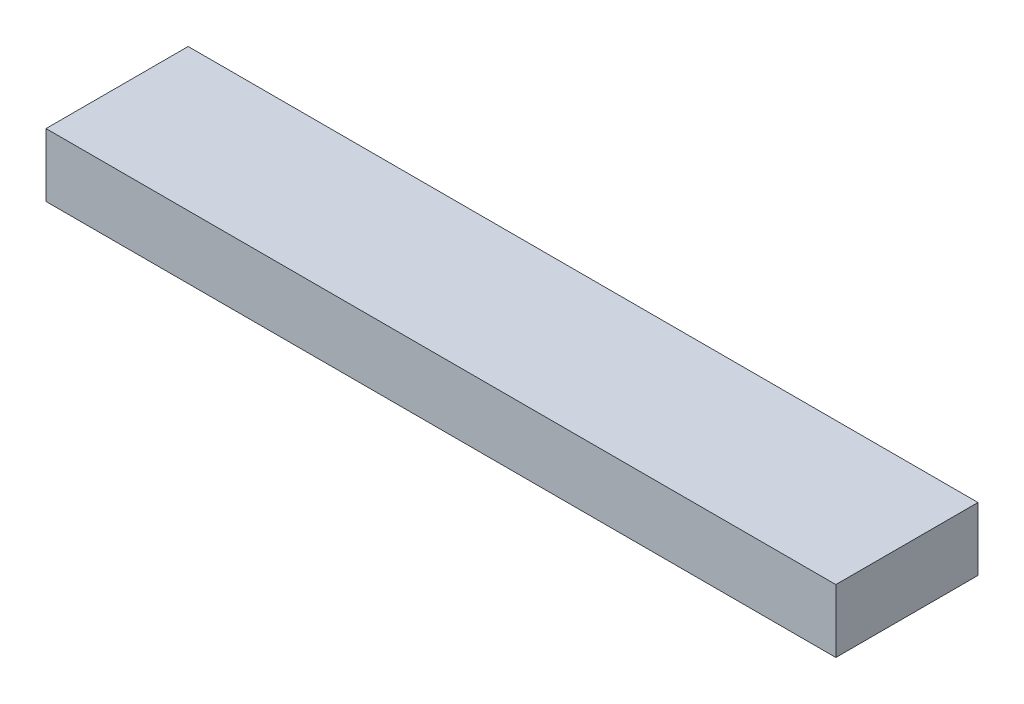
ISO-10303-21;
HEADER;
FILE_DESCRIPTION(('STEP AP214'),'2;1');
FILE_NAME('part.step','',(''),(''),'','','');
FILE_SCHEMA(('AUTOMOTIVE_DESIGN { 1 0 10303 214 1 1 1 1 }'));
ENDSEC;
DATA;
#1=APPLICATION_CONTEXT('core data for automotive mechanical design processes');
#2=APPLICATION_PROTOCOL_DEFINITION('international standard','automotive_design',2000,#1);
#3=PRODUCT_CONTEXT('',#1,'mechanical');
#4=PRODUCT('Part','Part','',(#3));
#5=PRODUCT_RELATED_PRODUCT_CATEGORY('part','',(#4));
#6=PRODUCT_DEFINITION_FORMATION('','',#4);
#7=PRODUCT_DEFINITION_CONTEXT('part definition',#1,'design');
#8=PRODUCT_DEFINITION('design','',#6,#7);
#9=PRODUCT_DEFINITION_SHAPE('','',#8);
#10=(LENGTH_UNIT() NAMED_UNIT(*) SI_UNIT(.MILLI.,.METRE.));
#11=(NAMED_UNIT(*) PLANE_ANGLE_UNIT() SI_UNIT($,.RADIAN.));
#12=(NAMED_UNIT(*) SI_UNIT($,.STERADIAN.) SOLID_ANGLE_UNIT());
#13=UNCERTAINTY_MEASURE_WITH_UNIT(LENGTH_MEASURE(1.E-05),#10,'distance_accuracy_value','');
#14=(GEOMETRIC_REPRESENTATION_CONTEXT(3) GLOBAL_UNCERTAINTY_ASSIGNED_CONTEXT((#13)) GLOBAL_UNIT_ASSIGNED_CONTEXT((#10,
#11,#12)) REPRESENTATION_CONTEXT('',''));
#15=CARTESIAN_POINT('',(0.,0.,0.));
#16=DIRECTION('',(0.,0.,1.));
#17=DIRECTION('',(1.,0.,0.));
#18=AXIS2_PLACEMENT_3D('',#15,#16,#17);
#19=CARTESIAN_POINT('',(125.,10.,-22.5));
#20=DIRECTION('',(-1.,0.,0.));
#21=DIRECTION('',(0.,0.,1.));
#22=AXIS2_PLACEMENT_3D('',#19,#20,#21);
#23=PLANE('',#22);
#24=DIRECTION('',(0.,0.,-1.));
#25=VECTOR('',#24,1.);
#26=CARTESIAN_POINT('',(125.,-10.,-22.5));
#27=LINE('',#26,#25);
#28=CARTESIAN_POINT('',(125.,-10.,22.5));
#29=VERTEX_POINT('',#28);
#30=CARTESIAN_POINT('',(125.,-10.,-22.5));
#31=VERTEX_POINT('',#30);
#32=EDGE_CURVE('E107',#29,#31,#27,.T.);
#33=ORIENTED_EDGE('',*,*,#32,.T.);
#34=DIRECTION('',(0.,-1.,0.));
#35=VECTOR('',#34,1.);
#36=CARTESIAN_POINT('',(125.,10.,-22.5));
#37=LINE('',#36,#35);
#38=CARTESIAN_POINT('',(125.,10.,-22.5));
#39=VERTEX_POINT('',#38);
#40=EDGE_CURVE('E11',#39,#31,#37,.T.);
#41=ORIENTED_EDGE('',*,*,#40,.F.);
#42=DIRECTION('',(0.,0.,-1.));
#43=VECTOR('',#42,1.);
#44=CARTESIAN_POINT('',(125.,10.,-22.5));
#45=LINE('',#44,#43);
#46=CARTESIAN_POINT('',(125.,10.,22.5));
#47=VERTEX_POINT('',#46);
#48=EDGE_CURVE('E91',#47,#39,#45,.T.);
#49=ORIENTED_EDGE('',*,*,#48,.F.);
#50=DIRECTION('',(0.,-1.,0.));
#51=VECTOR('',#50,1.);
#52=CARTESIAN_POINT('',(125.,10.,22.5));
#53=LINE('',#52,#51);
#54=EDGE_CURVE('E103',#47,#29,#53,.T.);
#55=ORIENTED_EDGE('',*,*,#54,.T.);
#56=EDGE_LOOP('',(#33,#41,#49,#55));
#57=FACE_BOUND('',#56,.T.);
#58=ADVANCED_FACE('F39',(#57),#23,.F.);
#59=CARTESIAN_POINT('',(-125.,10.,-22.5));
#60=DIRECTION('',(0.,0.,1.));
#61=DIRECTION('',(1.,0.,0.));
#62=AXIS2_PLACEMENT_3D('',#59,#60,#61);
#63=PLANE('',#62);
#64=DIRECTION('',(-1.,0.,0.));
#65=VECTOR('',#64,1.);
#66=CARTESIAN_POINT('',(-125.,-10.,-22.5));
#67=LINE('',#66,#65);
#68=CARTESIAN_POINT('',(-125.,-10.,-22.5));
#69=VERTEX_POINT('',#68);
#70=EDGE_CURVE('E96',#31,#69,#67,.T.);
#71=ORIENTED_EDGE('',*,*,#70,.T.);
#72=DIRECTION('',(0.,-1.,0.));
#73=VECTOR('',#72,1.);
#74=CARTESIAN_POINT('',(-125.,10.,-22.5));
#75=LINE('',#74,#73);
#76=CARTESIAN_POINT('',(-125.,10.,-22.5));
#77=VERTEX_POINT('',#76);
#78=EDGE_CURVE('E48',#77,#69,#75,.T.);
#79=ORIENTED_EDGE('',*,*,#78,.F.);
#80=DIRECTION('',(-1.,0.,0.));
#81=VECTOR('',#80,1.);
#82=CARTESIAN_POINT('',(-125.,10.,-22.5));
#83=LINE('',#82,#81);
#84=EDGE_CURVE('E86',#39,#77,#83,.T.);
#85=ORIENTED_EDGE('',*,*,#84,.F.);
#86=ORIENTED_EDGE('',*,*,#40,.T.);
#87=EDGE_LOOP('',(#71,#79,#85,#86));
#88=FACE_BOUND('',#87,.T.);
#89=ADVANCED_FACE('F95',(#88),#63,.F.);
#90=CARTESIAN_POINT('',(-125.,10.,-22.5));
#91=DIRECTION('',(1.,0.,0.));
#92=DIRECTION('',(0.,0.,-1.));
#93=AXIS2_PLACEMENT_3D('',#90,#91,#92);
#94=PLANE('',#93);
#95=DIRECTION('',(0.,0.,1.));
#96=VECTOR('',#95,1.);
#97=CARTESIAN_POINT('',(-125.,-10.,-22.5));
#98=LINE('',#97,#96);
#99=CARTESIAN_POINT('',(-125.,-10.,22.5));
#100=VERTEX_POINT('',#99);
#101=EDGE_CURVE('E73',#69,#100,#98,.T.);
#102=ORIENTED_EDGE('',*,*,#101,.T.);
#103=DIRECTION('',(0.,-1.,0.));
#104=VECTOR('',#103,1.);
#105=CARTESIAN_POINT('',(-125.,10.,22.5));
#106=LINE('',#105,#104);
#107=CARTESIAN_POINT('',(-125.,10.,22.5));
#108=VERTEX_POINT('',#107);
#109=EDGE_CURVE('E98',#108,#100,#106,.T.);
#110=ORIENTED_EDGE('',*,*,#109,.F.);
#111=DIRECTION('',(0.,0.,1.));
#112=VECTOR('',#111,1.);
#113=CARTESIAN_POINT('',(-125.,10.,-22.5));
#114=LINE('',#113,#112);
#115=EDGE_CURVE('E89',#77,#108,#114,.T.);
#116=ORIENTED_EDGE('',*,*,#115,.F.);
#117=ORIENTED_EDGE('',*,*,#78,.T.);
#118=EDGE_LOOP('',(#102,#110,#116,#117));
#119=FACE_BOUND('',#118,.T.);
#120=ADVANCED_FACE('F99',(#119),#94,.F.);
#121=CARTESIAN_POINT('',(-125.,10.,22.5));
#122=DIRECTION('',(0.,0.,-1.));
#123=DIRECTION('',(-1.,0.,0.));
#124=AXIS2_PLACEMENT_3D('',#121,#122,#123);
#125=PLANE('',#124);
#126=DIRECTION('',(1.,0.,0.));
#127=VECTOR('',#126,1.);
#128=CARTESIAN_POINT('',(-125.,-10.,22.5));
#129=LINE('',#128,#127);
#130=EDGE_CURVE('E79',#100,#29,#129,.T.);
#131=ORIENTED_EDGE('',*,*,#130,.T.);
#132=ORIENTED_EDGE('',*,*,#54,.F.);
#133=DIRECTION('',(1.,0.,0.));
#134=VECTOR('',#133,1.);
#135=CARTESIAN_POINT('',(-125.,10.,22.5));
#136=LINE('',#135,#134);
#137=EDGE_CURVE('E56',#108,#47,#136,.T.);
#138=ORIENTED_EDGE('',*,*,#137,.F.);
#139=ORIENTED_EDGE('',*,*,#109,.T.);
#140=EDGE_LOOP('',(#131,#132,#138,#139));
#141=FACE_BOUND('',#140,.T.);
#142=ADVANCED_FACE('F120',(#141),#125,.F.);
#143=CARTESIAN_POINT('',(0.,10.,0.));
#144=DIRECTION('',(0.,1.,0.));
#145=DIRECTION('',(0.,0.,1.));
#146=AXIS2_PLACEMENT_3D('',#143,#144,#145);
#147=PLANE('',#146);
#148=ORIENTED_EDGE('',*,*,#48,.T.);
#149=ORIENTED_EDGE('',*,*,#84,.T.);
#150=ORIENTED_EDGE('',*,*,#115,.T.);
#151=ORIENTED_EDGE('',*,*,#137,.T.);
#152=EDGE_LOOP('',(#148,#149,#150,#151));
#153=FACE_BOUND('',#152,.T.);
#154=ADVANCED_FACE('F87',(#153),#147,.T.);
#155=CARTESIAN_POINT('',(0.,-10.,0.));
#156=DIRECTION('',(0.,1.,0.));
#157=DIRECTION('',(0.,0.,1.));
#158=AXIS2_PLACEMENT_3D('',#155,#156,#157);
#159=PLANE('',#158);
#160=ORIENTED_EDGE('',*,*,#32,.F.);
#161=ORIENTED_EDGE('',*,*,#130,.F.);
#162=ORIENTED_EDGE('',*,*,#101,.F.);
#163=ORIENTED_EDGE('',*,*,#70,.F.);
#164=EDGE_LOOP('',(#160,#161,#162,#163));
#165=FACE_BOUND('',#164,.T.);
#166=ADVANCED_FACE('F123',(#165),#159,.F.);
#167=CLOSED_SHELL('',(#58,#89,#120,#142,#154,#166));
#168=MANIFOLD_SOLID_BREP('B2',#167);
#169=ADVANCED_BREP_SHAPE_REPRESENTATION('',(#18,#168),#14);
#170=SHAPE_DEFINITION_REPRESENTATION(#9,#169);
ENDSEC;
END-ISO-10303-21;
